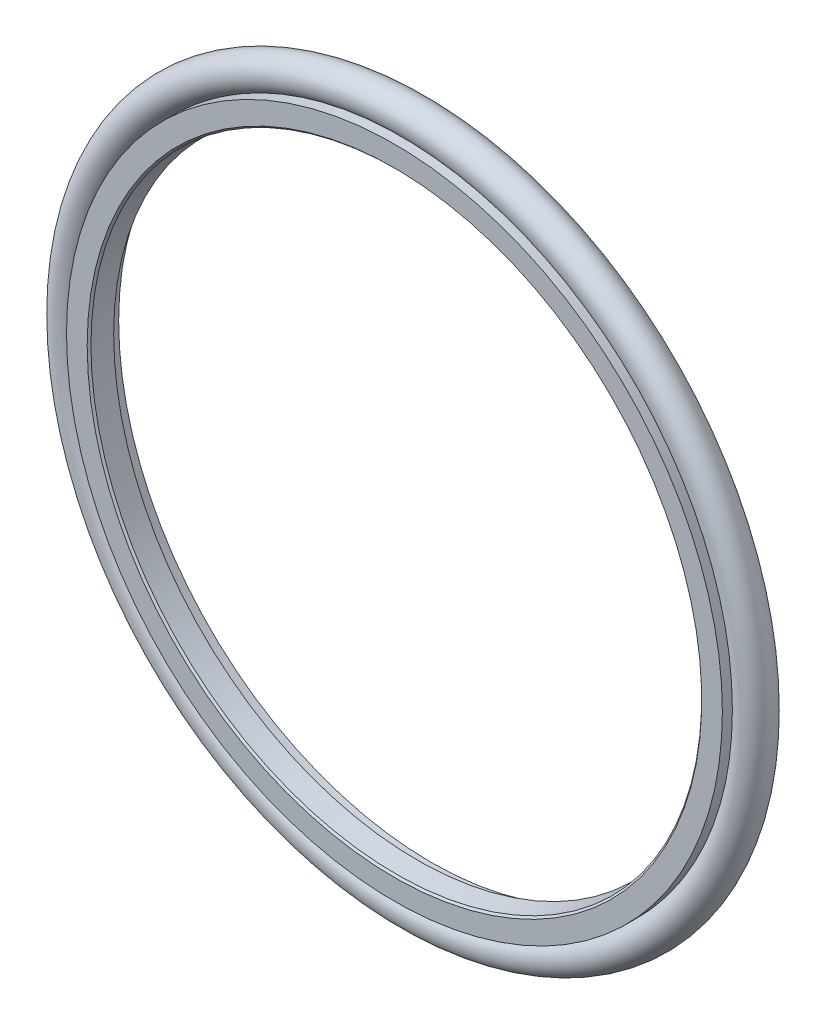
ISO-10303-21;
HEADER;
FILE_DESCRIPTION(('STEP AP214'),'2;1');
FILE_NAME('part.step','',(''),(''),'','','');
FILE_SCHEMA(('AUTOMOTIVE_DESIGN { 1 0 10303 214 1 1 1 1 }'));
ENDSEC;
DATA;
#1=APPLICATION_CONTEXT('core data for automotive mechanical design processes');
#2=APPLICATION_PROTOCOL_DEFINITION('international standard','automotive_design',2000,#1);
#3=PRODUCT_CONTEXT('',#1,'mechanical');
#4=PRODUCT('Part','Part','',(#3));
#5=PRODUCT_RELATED_PRODUCT_CATEGORY('part','',(#4));
#6=PRODUCT_DEFINITION_FORMATION('','',#4);
#7=PRODUCT_DEFINITION_CONTEXT('part definition',#1,'design');
#8=PRODUCT_DEFINITION('design','',#6,#7);
#9=PRODUCT_DEFINITION_SHAPE('','',#8);
#10=(LENGTH_UNIT() NAMED_UNIT(*) SI_UNIT(.MILLI.,.METRE.));
#11=(NAMED_UNIT(*) PLANE_ANGLE_UNIT() SI_UNIT($,.RADIAN.));
#12=(NAMED_UNIT(*) SI_UNIT($,.STERADIAN.) SOLID_ANGLE_UNIT());
#13=UNCERTAINTY_MEASURE_WITH_UNIT(LENGTH_MEASURE(1.E-05),#10,'distance_accuracy_value','');
#14=(GEOMETRIC_REPRESENTATION_CONTEXT(3) GLOBAL_UNCERTAINTY_ASSIGNED_CONTEXT((#13)) GLOBAL_UNIT_ASSIGNED_CONTEXT((#10,
#11,#12)) REPRESENTATION_CONTEXT('',''));
#15=CARTESIAN_POINT('',(0.,0.,0.));
#16=DIRECTION('',(0.,0.,1.));
#17=DIRECTION('',(1.,0.,0.));
#18=AXIS2_PLACEMENT_3D('',#15,#16,#17);
#19=CARTESIAN_POINT('',(0.,0.,1.975));
#20=DIRECTION('',(0.,0.,-1.));
#21=DIRECTION('',(-1.,0.,0.));
#22=AXIS2_PLACEMENT_3D('',#19,#20,#21);
#23=TOROIDAL_SURFACE('',#22,36.485,1.765);
#24=CARTESIAN_POINT('',(-38.25,0.,1.975));
#25=VERTEX_POINT('',#24);
#26=VERTEX_LOOP('',#25);
#27=FACE_BOUND('',#26,.T.);
#28=ADVANCED_FACE('F48',(#27),#23,.T.);
#29=CLOSED_SHELL('',(#28));
#30=MANIFOLD_SOLID_BREP('B2',#29);
#31=CARTESIAN_POINT('',(0.,0.,0.));
#32=DIRECTION('',(0.,0.,-1.));
#33=DIRECTION('',(-1.,0.,0.));
#34=AXIS2_PLACEMENT_3D('',#31,#32,#33);
#35=CYLINDRICAL_SURFACE('',#34,33.3);
#36=CARTESIAN_POINT('',(0.,0.,0.));
#37=DIRECTION('',(0.,0.,-1.));
#38=DIRECTION('',(-1.,0.,0.));
#39=AXIS2_PLACEMENT_3D('',#36,#37,#38);
#40=CIRCLE('',#39,33.3);
#41=CARTESIAN_POINT('',(-33.3,0.,0.));
#42=VERTEX_POINT('',#41);
#43=EDGE_CURVE('E47',#42,#42,#40,.T.);
#44=ORIENTED_EDGE('',*,*,#43,.T.);
#45=EDGE_LOOP('',(#44));
#46=FACE_BOUND('',#45,.T.);
#47=CARTESIAN_POINT('',(0.,0.,0.9));
#48=DIRECTION('',(0.,0.,-1.));
#49=DIRECTION('',(-1.,0.,0.));
#50=AXIS2_PLACEMENT_3D('',#47,#48,#49);
#51=CIRCLE('',#50,33.3);
#52=CARTESIAN_POINT('',(-33.3,0.,0.9));
#53=VERTEX_POINT('',#52);
#54=EDGE_CURVE('E87',#53,#53,#51,.T.);
#55=ORIENTED_EDGE('',*,*,#54,.F.);
#56=EDGE_LOOP('',(#55));
#57=FACE_BOUND('',#56,.T.);
#58=ADVANCED_FACE('F62',(#46,#57),#35,.F.);
#59=CARTESIAN_POINT('',(0.,33.3,0.));
#60=DIRECTION('',(0.,0.,-1.));
#61=DIRECTION('',(-1.,0.,0.));
#62=AXIS2_PLACEMENT_3D('',#59,#60,#61);
#63=PLANE('',#62);
#64=CARTESIAN_POINT('',(0.,0.,0.));
#65=DIRECTION('',(0.,0.,-1.));
#66=DIRECTION('',(-1.,0.,0.));
#67=AXIS2_PLACEMENT_3D('',#64,#65,#66);
#68=CIRCLE('',#67,34.9);
#69=CARTESIAN_POINT('',(-34.9,0.,0.));
#70=VERTEX_POINT('',#69);
#71=EDGE_CURVE('E68',#70,#70,#68,.T.);
#72=ORIENTED_EDGE('',*,*,#71,.T.);
#73=EDGE_LOOP('',(#72));
#74=FACE_BOUND('',#73,.T.);
#75=ORIENTED_EDGE('',*,*,#43,.F.);
#76=EDGE_LOOP('',(#75));
#77=FACE_BOUND('',#76,.T.);
#78=ADVANCED_FACE('F95',(#74,#77),#63,.T.);
#79=CARTESIAN_POINT('',(0.,0.,0.));
#80=DIRECTION('',(0.,0.,-1.));
#81=DIRECTION('',(-1.,0.,0.));
#82=AXIS2_PLACEMENT_3D('',#79,#80,#81);
#83=CYLINDRICAL_SURFACE('',#82,34.9);
#84=CARTESIAN_POINT('',(0.,0.,3.95));
#85=DIRECTION('',(0.,0.,-1.));
#86=DIRECTION('',(-1.,0.,0.));
#87=AXIS2_PLACEMENT_3D('',#84,#85,#86);
#88=CIRCLE('',#87,34.9);
#89=CARTESIAN_POINT('',(-34.9,0.,3.95));
#90=VERTEX_POINT('',#89);
#91=EDGE_CURVE('E72',#90,#90,#88,.T.);
#92=ORIENTED_EDGE('',*,*,#91,.T.);
#93=EDGE_LOOP('',(#92));
#94=FACE_BOUND('',#93,.T.);
#95=ORIENTED_EDGE('',*,*,#71,.F.);
#96=EDGE_LOOP('',(#95));
#97=FACE_BOUND('',#96,.T.);
#98=ADVANCED_FACE('F99',(#94,#97),#83,.T.);
#99=CARTESIAN_POINT('',(0.,34.9,3.95));
#100=DIRECTION('',(0.,0.,1.));
#101=DIRECTION('',(1.,0.,0.));
#102=AXIS2_PLACEMENT_3D('',#99,#100,#101);
#103=PLANE('',#102);
#104=CARTESIAN_POINT('',(0.,0.,3.95));
#105=DIRECTION('',(0.,0.,-1.));
#106=DIRECTION('',(-1.,0.,0.));
#107=AXIS2_PLACEMENT_3D('',#104,#105,#106);
#108=CIRCLE('',#107,32.7);
#109=CARTESIAN_POINT('',(-32.7,0.,3.95));
#110=VERTEX_POINT('',#109);
#111=EDGE_CURVE('E76',#110,#110,#108,.T.);
#112=ORIENTED_EDGE('',*,*,#111,.T.);
#113=EDGE_LOOP('',(#112));
#114=FACE_BOUND('',#113,.T.);
#115=ORIENTED_EDGE('',*,*,#91,.F.);
#116=EDGE_LOOP('',(#115));
#117=FACE_BOUND('',#116,.T.);
#118=ADVANCED_FACE('F103',(#114,#117),#103,.T.);
#119=CARTESIAN_POINT('',(0.,0.,3.95));
#120=DIRECTION('',(0.,0.,1.));
#121=DIRECTION('',(1.,0.,0.));
#122=AXIS2_PLACEMENT_3D('',#119,#120,#121);
#123=CONICAL_SURFACE('',#122,32.7,0.785398163397444);
#124=CARTESIAN_POINT('',(0.,0.,3.75));
#125=DIRECTION('',(0.,0.,-1.));
#126=DIRECTION('',(-1.,0.,0.));
#127=AXIS2_PLACEMENT_3D('',#124,#125,#126);
#128=CIRCLE('',#127,32.5);
#129=CARTESIAN_POINT('',(-32.5,0.,3.75));
#130=VERTEX_POINT('',#129);
#131=EDGE_CURVE('E81',#130,#130,#128,.T.);
#132=ORIENTED_EDGE('',*,*,#131,.T.);
#133=EDGE_LOOP('',(#132));
#134=FACE_BOUND('',#133,.T.);
#135=ORIENTED_EDGE('',*,*,#111,.F.);
#136=EDGE_LOOP('',(#135));
#137=FACE_BOUND('',#136,.T.);
#138=ADVANCED_FACE('F110',(#134,#137),#123,.F.);
#139=CARTESIAN_POINT('',(0.,0.,3.75));
#140=DIRECTION('',(0.,0.,1.));
#141=DIRECTION('',(1.,0.,0.));
#142=AXIS2_PLACEMENT_3D('',#139,#140,#141);
#143=CONICAL_SURFACE('',#142,32.5,0.0754122728009659);
#144=CARTESIAN_POINT('',(0.,0.,1.5));
#145=DIRECTION('',(0.,0.,-1.));
#146=DIRECTION('',(-1.,0.,0.));
#147=AXIS2_PLACEMENT_3D('',#144,#145,#146);
#148=CIRCLE('',#147,32.33);
#149=CARTESIAN_POINT('',(-32.33,0.,1.5));
#150=VERTEX_POINT('',#149);
#151=EDGE_CURVE('E84',#150,#150,#148,.T.);
#152=ORIENTED_EDGE('',*,*,#151,.T.);
#153=EDGE_LOOP('',(#152));
#154=FACE_BOUND('',#153,.T.);
#155=ORIENTED_EDGE('',*,*,#131,.F.);
#156=EDGE_LOOP('',(#155));
#157=FACE_BOUND('',#156,.T.);
#158=ADVANCED_FACE('F114',(#154,#157),#143,.F.);
#159=CARTESIAN_POINT('',(0.,0.,1.5));
#160=DIRECTION('',(0.,0.,-1.));
#161=DIRECTION('',(-1.,0.,0.));
#162=AXIS2_PLACEMENT_3D('',#159,#160,#161);
#163=CONICAL_SURFACE('',#162,32.33,1.01684381815387);
#164=ORIENTED_EDGE('',*,*,#54,.T.);
#165=EDGE_LOOP('',(#164));
#166=FACE_BOUND('',#165,.T.);
#167=ORIENTED_EDGE('',*,*,#151,.F.);
#168=EDGE_LOOP('',(#167));
#169=FACE_BOUND('',#168,.T.);
#170=ADVANCED_FACE('F91',(#166,#169),#163,.F.);
#171=CLOSED_SHELL('',(#58,#78,#98,#118,#138,#158,#170));
#172=MANIFOLD_SOLID_BREP('B6',#171);
#173=ADVANCED_BREP_SHAPE_REPRESENTATION('',(#18,#30,#172),#14);
#174=SHAPE_DEFINITION_REPRESENTATION(#9,#173);
ENDSEC;
END-ISO-10303-21;
